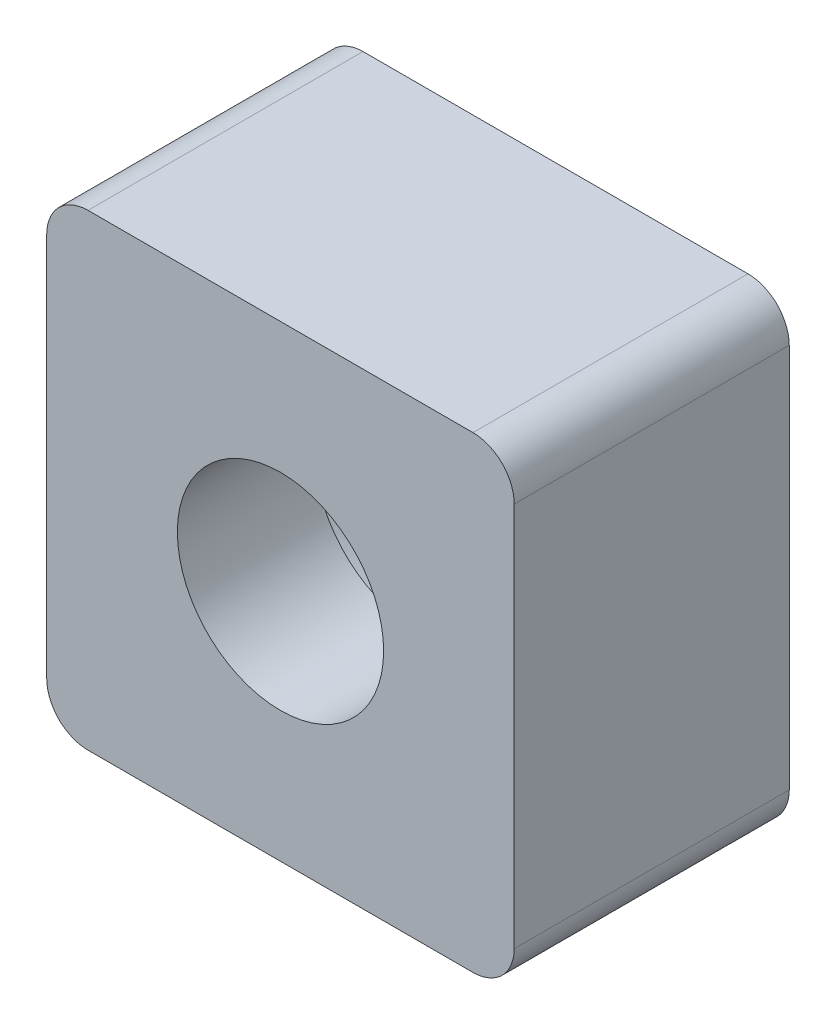
ISO-10303-21;
HEADER;
FILE_DESCRIPTION(('STEP AP214'),'2;1');
FILE_NAME('part.step','',(''),(''),'','','');
FILE_SCHEMA(('AUTOMOTIVE_DESIGN { 1 0 10303 214 1 1 1 1 }'));
ENDSEC;
DATA;
#1=APPLICATION_CONTEXT('core data for automotive mechanical design processes');
#2=APPLICATION_PROTOCOL_DEFINITION('international standard','automotive_design',2000,#1);
#3=PRODUCT_CONTEXT('',#1,'mechanical');
#4=PRODUCT('Part','Part','',(#3));
#5=PRODUCT_RELATED_PRODUCT_CATEGORY('part','',(#4));
#6=PRODUCT_DEFINITION_FORMATION('','',#4);
#7=PRODUCT_DEFINITION_CONTEXT('part definition',#1,'design');
#8=PRODUCT_DEFINITION('design','',#6,#7);
#9=PRODUCT_DEFINITION_SHAPE('','',#8);
#10=(LENGTH_UNIT() NAMED_UNIT(*) SI_UNIT(.MILLI.,.METRE.));
#11=(NAMED_UNIT(*) PLANE_ANGLE_UNIT() SI_UNIT($,.RADIAN.));
#12=(NAMED_UNIT(*) SI_UNIT($,.STERADIAN.) SOLID_ANGLE_UNIT());
#13=UNCERTAINTY_MEASURE_WITH_UNIT(LENGTH_MEASURE(1.E-05),#10,'distance_accuracy_value','');
#14=(GEOMETRIC_REPRESENTATION_CONTEXT(3) GLOBAL_UNCERTAINTY_ASSIGNED_CONTEXT((#13)) GLOBAL_UNIT_ASSIGNED_CONTEXT((#10,
#11,#12)) REPRESENTATION_CONTEXT('',''));
#15=CARTESIAN_POINT('',(0.,0.,0.));
#16=DIRECTION('',(0.,0.,1.));
#17=DIRECTION('',(1.,0.,0.));
#18=AXIS2_PLACEMENT_3D('',#15,#16,#17);
#19=CARTESIAN_POINT('',(0.,0.,-4.24264068711929));
#20=DIRECTION('',(0.,0.,1.));
#21=DIRECTION('',(1.,0.,0.));
#22=AXIS2_PLACEMENT_3D('',#19,#20,#21);
#23=CYLINDRICAL_SURFACE('',#22,1.5);
#24=CARTESIAN_POINT('',(0.,0.,4.));
#25=DIRECTION('',(0.,0.,1.));
#26=DIRECTION('',(1.,0.,0.));
#27=AXIS2_PLACEMENT_3D('',#24,#25,#26);
#28=CIRCLE('',#27,1.5);
#29=CARTESIAN_POINT('',(1.5,0.,4.));
#30=VERTEX_POINT('',#29);
#31=EDGE_CURVE('E210',#30,#30,#28,.T.);
#32=ORIENTED_EDGE('',*,*,#31,.T.);
#33=EDGE_LOOP('',(#32));
#34=FACE_BOUND('',#33,.T.);
#35=CARTESIAN_POINT('',(0.,0.,2.));
#36=DIRECTION('',(0.,0.,-1.));
#37=DIRECTION('',(-1.,0.,0.));
#38=AXIS2_PLACEMENT_3D('',#35,#36,#37);
#39=CIRCLE('',#38,1.5);
#40=CARTESIAN_POINT('',(-1.5,0.,2.));
#41=VERTEX_POINT('',#40);
#42=EDGE_CURVE('E39',#41,#41,#39,.F.);
#43=ORIENTED_EDGE('',*,*,#42,.F.);
#44=EDGE_LOOP('',(#43));
#45=FACE_BOUND('',#44,.T.);
#46=ADVANCED_FACE('F34',(#34,#45),#23,.F.);
#47=CARTESIAN_POINT('',(-2.79989338457967,3.40000000000003,4.));
#48=CARTESIAN_POINT('',(-2.95296602899174,3.40000000000008,4.));
#49=CARTESIAN_POINT('',(-3.27188283407694,3.27198446625344,4.));
#50=CARTESIAN_POINT('',(-3.39988196149886,2.95307118720388,4.));
#51=CARTESIAN_POINT('',(-3.3998819614989,2.80000000000004,4.));
#52=B_SPLINE_CURVE_WITH_KNOTS('',3,(#47,#48,#49,#50,#51),.UNSPECIFIED.,.F.,.F.,(4,1,4),
(-3.14159265358977,-2.35619449019233,-1.57079632679489),.UNSPECIFIED.);
#53=DIRECTION('',(0.,0.,-1.));
#54=VECTOR('',#53,1.);
#55=SURFACE_OF_LINEAR_EXTRUSION('',#52,#54);
#56=CARTESIAN_POINT('',(-2.79989338457967,3.40000000000003,0.));
#57=CARTESIAN_POINT('',(-2.95296602899174,3.40000000000008,0.));
#58=CARTESIAN_POINT('',(-3.27188283407694,3.27198446625344,0.));
#59=CARTESIAN_POINT('',(-3.39988196149886,2.95307118720388,0.));
#60=CARTESIAN_POINT('',(-3.3998819614989,2.80000000000004,0.));
#61=B_SPLINE_CURVE_WITH_KNOTS('',3,(#56,#57,#58,#59,#60),.UNSPECIFIED.,.F.,.F.,(4,1,4),
(-3.14159265358977,-2.35619449019233,-1.57079632679489),.UNSPECIFIED.);
#62=CARTESIAN_POINT('',(-2.79989338457967,3.4,0.));
#63=VERTEX_POINT('',#62);
#64=CARTESIAN_POINT('',(-3.3998819614989,2.80000000000004,0.));
#65=VERTEX_POINT('',#64);
#66=EDGE_CURVE('E206',#63,#65,#61,.T.);
#67=ORIENTED_EDGE('',*,*,#66,.T.);
#68=DIRECTION('',(0.,0.,-1.));
#69=VECTOR('',#68,1.);
#70=CARTESIAN_POINT('',(-3.3998819614989,2.80000000000004,4.));
#71=LINE('',#70,#69);
#72=CARTESIAN_POINT('',(-3.3998819614989,2.80000000000004,4.));
#73=VERTEX_POINT('',#72);
#74=EDGE_CURVE('E11',#73,#65,#71,.T.);
#75=ORIENTED_EDGE('',*,*,#74,.F.);
#76=CARTESIAN_POINT('',(-2.79989338457967,3.4,4.));
#77=VERTEX_POINT('',#76);
#78=EDGE_CURVE('E243',#77,#73,#52,.T.);
#79=ORIENTED_EDGE('',*,*,#78,.F.);
#80=DIRECTION('',(0.,0.,-1.));
#81=VECTOR('',#80,1.);
#82=CARTESIAN_POINT('',(-2.79989338457967,3.4,4.));
#83=LINE('',#82,#81);
#84=EDGE_CURVE('E129',#77,#63,#83,.T.);
#85=ORIENTED_EDGE('',*,*,#84,.T.);
#86=EDGE_LOOP('',(#67,#75,#79,#85));
#87=FACE_BOUND('',#86,.T.);
#88=ADVANCED_FACE('F36',(#87),#55,.F.);
#89=CARTESIAN_POINT('',(-3.3998819614989,2.80000000000004,4.));
#90=DIRECTION('',(1.,0.,0.));
#91=DIRECTION('',(0.,1.,0.));
#92=AXIS2_PLACEMENT_3D('',#89,#90,#91);
#93=PLANE('',#92);
#94=DIRECTION('',(0.,-1.,0.));
#95=VECTOR('',#94,1.);
#96=CARTESIAN_POINT('',(-3.3998819614989,2.80000000000004,0.));
#97=LINE('',#96,#95);
#98=CARTESIAN_POINT('',(-3.39988196149889,-2.80000000000004,0.));
#99=VERTEX_POINT('',#98);
#100=EDGE_CURVE('E208',#65,#99,#97,.T.);
#101=ORIENTED_EDGE('',*,*,#100,.T.);
#102=DIRECTION('',(0.,0.,-1.));
#103=VECTOR('',#102,1.);
#104=CARTESIAN_POINT('',(-3.39988196149889,-2.80000000000004,4.));
#105=LINE('',#104,#103);
#106=CARTESIAN_POINT('',(-3.39988196149889,-2.80000000000004,4.));
#107=VERTEX_POINT('',#106);
#108=EDGE_CURVE('E45',#107,#99,#105,.T.);
#109=ORIENTED_EDGE('',*,*,#108,.F.);
#110=DIRECTION('',(0.,-1.,0.));
#111=VECTOR('',#110,1.);
#112=CARTESIAN_POINT('',(-3.3998819614989,2.80000000000004,4.));
#113=LINE('',#112,#111);
#114=EDGE_CURVE('E96',#73,#107,#113,.T.);
#115=ORIENTED_EDGE('',*,*,#114,.F.);
#116=ORIENTED_EDGE('',*,*,#74,.T.);
#117=EDGE_LOOP('',(#101,#109,#115,#116));
#118=FACE_BOUND('',#117,.T.);
#119=ADVANCED_FACE('F172',(#118),#93,.F.);
#120=CARTESIAN_POINT('',(-3.3998819614989,-2.80000000000004,4.));
#121=CARTESIAN_POINT('',(-3.39988196149896,-2.95307118720388,4.));
#122=CARTESIAN_POINT('',(-3.27188283407687,-3.27198446625344,4.));
#123=CARTESIAN_POINT('',(-2.95296602899173,-3.40000000000003,4.));
#124=CARTESIAN_POINT('',(-2.79989338457965,-3.40000000000008,4.));
#125=B_SPLINE_CURVE_WITH_KNOTS('',3,(#120,#121,#122,#123,#124),.UNSPECIFIED.,.F.,.F.,(4,1,4),
(-1.57079632679526,-0.785398163397782,-3.00696852117388E-13),.UNSPECIFIED.);
#126=DIRECTION('',(0.,0.,-1.));
#127=VECTOR('',#126,1.);
#128=SURFACE_OF_LINEAR_EXTRUSION('',#125,#127);
#129=CARTESIAN_POINT('',(-3.3998819614989,-2.80000000000004,0.));
#130=CARTESIAN_POINT('',(-3.39988196149896,-2.95307118720388,0.));
#131=CARTESIAN_POINT('',(-3.27188283407687,-3.27198446625344,0.));
#132=CARTESIAN_POINT('',(-2.95296602899173,-3.40000000000003,0.));
#133=CARTESIAN_POINT('',(-2.79989338457965,-3.40000000000008,0.));
#134=B_SPLINE_CURVE_WITH_KNOTS('',3,(#129,#130,#131,#132,#133),.UNSPECIFIED.,.F.,.F.,(4,1,4),
(-1.57079632679526,-0.785398163397782,-3.00696852117388E-13),.UNSPECIFIED.);
#135=CARTESIAN_POINT('',(-2.79989338457965,-3.40000000000008,0.));
#136=VERTEX_POINT('',#135);
#137=EDGE_CURVE('E211',#99,#136,#134,.T.);
#138=ORIENTED_EDGE('',*,*,#137,.T.);
#139=DIRECTION('',(0.,0.,-1.));
#140=VECTOR('',#139,1.);
#141=CARTESIAN_POINT('',(-2.79989338457965,-3.40000000000008,4.));
#142=LINE('',#141,#140);
#143=CARTESIAN_POINT('',(-2.79989338457965,-3.40000000000008,4.));
#144=VERTEX_POINT('',#143);
#145=EDGE_CURVE('E250',#144,#136,#142,.T.);
#146=ORIENTED_EDGE('',*,*,#145,.F.);
#147=EDGE_CURVE('E162',#107,#144,#125,.T.);
#148=ORIENTED_EDGE('',*,*,#147,.F.);
#149=ORIENTED_EDGE('',*,*,#108,.T.);
#150=EDGE_LOOP('',(#138,#146,#148,#149));
#151=FACE_BOUND('',#150,.T.);
#152=ADVANCED_FACE('F170',(#151),#128,.F.);
#153=CARTESIAN_POINT('',(-2.79989338457967,-3.40000000000003,4.));
#154=DIRECTION('',(0.,1.,0.));
#155=DIRECTION('',(-1.,0.,0.));
#156=AXIS2_PLACEMENT_3D('',#153,#154,#155);
#157=PLANE('',#156);
#158=DIRECTION('',(1.,0.,0.));
#159=VECTOR('',#158,1.);
#160=CARTESIAN_POINT('',(-2.79989338457967,-3.40000000000003,0.));
#161=LINE('',#160,#159);
#162=CARTESIAN_POINT('',(2.79989338457971,-3.40000000000008,0.));
#163=VERTEX_POINT('',#162);
#164=EDGE_CURVE('E223',#136,#163,#161,.T.);
#165=ORIENTED_EDGE('',*,*,#164,.T.);
#166=DIRECTION('',(0.,0.,-1.));
#167=VECTOR('',#166,1.);
#168=CARTESIAN_POINT('',(2.79989338457971,-3.40000000000008,4.));
#169=LINE('',#168,#167);
#170=CARTESIAN_POINT('',(2.79989338457971,-3.40000000000008,4.));
#171=VERTEX_POINT('',#170);
#172=EDGE_CURVE('E247',#171,#163,#169,.T.);
#173=ORIENTED_EDGE('',*,*,#172,.F.);
#174=DIRECTION('',(1.,0.,0.));
#175=VECTOR('',#174,1.);
#176=CARTESIAN_POINT('',(-2.79989338457967,-3.40000000000003,4.));
#177=LINE('',#176,#175);
#178=EDGE_CURVE('E157',#144,#171,#177,.T.);
#179=ORIENTED_EDGE('',*,*,#178,.F.);
#180=ORIENTED_EDGE('',*,*,#145,.T.);
#181=EDGE_LOOP('',(#165,#173,#179,#180));
#182=FACE_BOUND('',#181,.T.);
#183=ADVANCED_FACE('F150',(#182),#157,.F.);
#184=CARTESIAN_POINT('',(2.79989338457971,-3.40000000000008,4.));
#185=CARTESIAN_POINT('',(2.95296602899178,-3.40000000000007,4.));
#186=CARTESIAN_POINT('',(3.27188283407693,-3.27198446625344,4.));
#187=CARTESIAN_POINT('',(3.39988196149893,-2.95307118720388,4.));
#188=CARTESIAN_POINT('',(3.39988196149891,-2.80000000000004,4.));
#189=B_SPLINE_CURVE_WITH_KNOTS('',3,(#184,#185,#186,#187,#188),.UNSPECIFIED.,.F.,.F.,(4,1,4),
(0.,0.785398163397447,1.57079632679489),.UNSPECIFIED.);
#190=DIRECTION('',(0.,0.,-1.));
#191=VECTOR('',#190,1.);
#192=SURFACE_OF_LINEAR_EXTRUSION('',#189,#191);
#193=CARTESIAN_POINT('',(2.79989338457971,-3.40000000000008,0.));
#194=CARTESIAN_POINT('',(2.95296602899178,-3.40000000000007,0.));
#195=CARTESIAN_POINT('',(3.27188283407693,-3.27198446625344,0.));
#196=CARTESIAN_POINT('',(3.39988196149893,-2.95307118720388,0.));
#197=CARTESIAN_POINT('',(3.39988196149891,-2.80000000000004,0.));
#198=B_SPLINE_CURVE_WITH_KNOTS('',3,(#193,#194,#195,#196,#197),.UNSPECIFIED.,.F.,.F.,(4,1,4),
(0.,0.785398163397447,1.57079632679489),.UNSPECIFIED.);
#199=CARTESIAN_POINT('',(3.39988196149891,-2.80000000000004,0.));
#200=VERTEX_POINT('',#199);
#201=EDGE_CURVE('E228',#163,#200,#198,.T.);
#202=ORIENTED_EDGE('',*,*,#201,.T.);
#203=DIRECTION('',(0.,0.,-1.));
#204=VECTOR('',#203,1.);
#205=CARTESIAN_POINT('',(3.39988196149891,-2.80000000000004,4.));
#206=LINE('',#205,#204);
#207=CARTESIAN_POINT('',(3.39988196149891,-2.80000000000004,4.));
#208=VERTEX_POINT('',#207);
#209=EDGE_CURVE('E124',#208,#200,#206,.T.);
#210=ORIENTED_EDGE('',*,*,#209,.F.);
#211=EDGE_CURVE('E115',#171,#208,#189,.T.);
#212=ORIENTED_EDGE('',*,*,#211,.F.);
#213=ORIENTED_EDGE('',*,*,#172,.T.);
#214=EDGE_LOOP('',(#202,#210,#212,#213));
#215=FACE_BOUND('',#214,.T.);
#216=ADVANCED_FACE('F147',(#215),#192,.F.);
#217=CARTESIAN_POINT('',(3.39988196149895,-2.80000000000001,4.));
#218=DIRECTION('',(-1.,0.,0.));
#219=DIRECTION('',(0.,-1.,0.));
#220=AXIS2_PLACEMENT_3D('',#217,#218,#219);
#221=PLANE('',#220);
#222=DIRECTION('',(0.,1.,0.));
#223=VECTOR('',#222,1.);
#224=CARTESIAN_POINT('',(3.39988196149895,-2.80000000000001,0.));
#225=LINE('',#224,#223);
#226=CARTESIAN_POINT('',(3.39988196149893,2.79999999999997,0.));
#227=VERTEX_POINT('',#226);
#228=EDGE_CURVE('E123',#200,#227,#225,.T.);
#229=ORIENTED_EDGE('',*,*,#228,.T.);
#230=DIRECTION('',(0.,0.,-1.));
#231=VECTOR('',#230,1.);
#232=CARTESIAN_POINT('',(3.39988196149893,2.79999999999997,4.));
#233=LINE('',#232,#231);
#234=CARTESIAN_POINT('',(3.39988196149893,2.79999999999997,4.));
#235=VERTEX_POINT('',#234);
#236=EDGE_CURVE('E120',#235,#227,#233,.T.);
#237=ORIENTED_EDGE('',*,*,#236,.F.);
#238=DIRECTION('',(0.,1.,0.));
#239=VECTOR('',#238,1.);
#240=CARTESIAN_POINT('',(3.39988196149895,-2.80000000000001,4.));
#241=LINE('',#240,#239);
#242=EDGE_CURVE('E109',#208,#235,#241,.T.);
#243=ORIENTED_EDGE('',*,*,#242,.F.);
#244=ORIENTED_EDGE('',*,*,#209,.T.);
#245=EDGE_LOOP('',(#229,#237,#243,#244));
#246=FACE_BOUND('',#245,.T.);
#247=ADVANCED_FACE('F121',(#246),#221,.F.);
#248=CARTESIAN_POINT('',(3.39988196149893,2.79999999999997,4.));
#249=CARTESIAN_POINT('',(3.39988196149892,2.95307118720381,4.));
#250=CARTESIAN_POINT('',(3.27188283407692,3.27198446625343,4.));
#251=CARTESIAN_POINT('',(2.95296602899178,3.40000000000001,4.));
#252=CARTESIAN_POINT('',(2.79989338457971,3.40000000000003,4.));
#253=B_SPLINE_CURVE_WITH_KNOTS('',3,(#248,#249,#250,#251,#252),.UNSPECIFIED.,.F.,.F.,(4,1,4),
(1.57079632679488,2.35619449019234,3.14159265358979),.UNSPECIFIED.);
#254=DIRECTION('',(0.,0.,-1.));
#255=VECTOR('',#254,1.);
#256=SURFACE_OF_LINEAR_EXTRUSION('',#253,#255);
#257=CARTESIAN_POINT('',(3.39988196149893,2.79999999999997,0.));
#258=CARTESIAN_POINT('',(3.39988196149892,2.95307118720381,0.));
#259=CARTESIAN_POINT('',(3.27188283407692,3.27198446625343,0.));
#260=CARTESIAN_POINT('',(2.95296602899178,3.40000000000001,0.));
#261=CARTESIAN_POINT('',(2.79989338457971,3.40000000000003,0.));
#262=B_SPLINE_CURVE_WITH_KNOTS('',3,(#257,#258,#259,#260,#261),.UNSPECIFIED.,.F.,.F.,(4,1,4),
(1.57079632679488,2.35619449019234,3.14159265358979),.UNSPECIFIED.);
#263=CARTESIAN_POINT('',(2.79989338457971,3.40000000000003,0.));
#264=VERTEX_POINT('',#263);
#265=EDGE_CURVE('E82',#227,#264,#262,.T.);
#266=ORIENTED_EDGE('',*,*,#265,.T.);
#267=DIRECTION('',(0.,0.,-1.));
#268=VECTOR('',#267,1.);
#269=CARTESIAN_POINT('',(2.79989338457971,3.40000000000003,4.));
#270=LINE('',#269,#268);
#271=CARTESIAN_POINT('',(2.79989338457971,3.40000000000003,4.));
#272=VERTEX_POINT('',#271);
#273=EDGE_CURVE('E125',#272,#264,#270,.T.);
#274=ORIENTED_EDGE('',*,*,#273,.F.);
#275=EDGE_CURVE('E113',#235,#272,#253,.T.);
#276=ORIENTED_EDGE('',*,*,#275,.F.);
#277=ORIENTED_EDGE('',*,*,#236,.T.);
#278=EDGE_LOOP('',(#266,#274,#276,#277));
#279=FACE_BOUND('',#278,.T.);
#280=ADVANCED_FACE('F127',(#279),#256,.F.);
#281=CARTESIAN_POINT('',(2.79989338457971,3.39999999999999,4.));
#282=DIRECTION('',(0.,-1.,0.));
#283=DIRECTION('',(1.,0.,0.));
#284=AXIS2_PLACEMENT_3D('',#281,#282,#283);
#285=PLANE('',#284);
#286=DIRECTION('',(-1.,0.,0.));
#287=VECTOR('',#286,1.);
#288=CARTESIAN_POINT('',(2.79989338457971,3.39999999999999,0.));
#289=LINE('',#288,#287);
#290=EDGE_CURVE('E88',#264,#63,#289,.T.);
#291=ORIENTED_EDGE('',*,*,#290,.T.);
#292=ORIENTED_EDGE('',*,*,#84,.F.);
#293=DIRECTION('',(-1.,0.,0.));
#294=VECTOR('',#293,1.);
#295=CARTESIAN_POINT('',(2.79989338457971,3.39999999999999,4.));
#296=LINE('',#295,#294);
#297=EDGE_CURVE('E53',#272,#77,#296,.T.);
#298=ORIENTED_EDGE('',*,*,#297,.F.);
#299=ORIENTED_EDGE('',*,*,#273,.T.);
#300=EDGE_LOOP('',(#291,#292,#298,#299));
#301=FACE_BOUND('',#300,.T.);
#302=ADVANCED_FACE('F143',(#301),#285,.F.);
#303=CARTESIAN_POINT('',(-3.22415341466112,3.22426002992771,4.));
#304=DIRECTION('',(0.,0.,-1.));
#305=DIRECTION('',(-1.,0.,0.));
#306=AXIS2_PLACEMENT_3D('',#303,#304,#305);
#307=PLANE('',#306);
#308=ORIENTED_EDGE('',*,*,#31,.F.);
#309=EDGE_LOOP('',(#308));
#310=FACE_BOUND('',#309,.T.);
#311=ORIENTED_EDGE('',*,*,#78,.T.);
#312=ORIENTED_EDGE('',*,*,#114,.T.);
#313=ORIENTED_EDGE('',*,*,#147,.T.);
#314=ORIENTED_EDGE('',*,*,#178,.T.);
#315=ORIENTED_EDGE('',*,*,#211,.T.);
#316=ORIENTED_EDGE('',*,*,#242,.T.);
#317=ORIENTED_EDGE('',*,*,#275,.T.);
#318=ORIENTED_EDGE('',*,*,#297,.T.);
#319=EDGE_LOOP('',(#311,#312,#313,#314,#315,#316,#317,#318));
#320=FACE_BOUND('',#319,.T.);
#321=ADVANCED_FACE('F111',(#310,#320),#307,.F.);
#322=CARTESIAN_POINT('',(-3.22415341466112,3.22426002992771,0.));
#323=DIRECTION('',(0.,0.,-1.));
#324=DIRECTION('',(-1.,0.,0.));
#325=AXIS2_PLACEMENT_3D('',#322,#323,#324);
#326=PLANE('',#325);
#327=CARTESIAN_POINT('',(0.,0.,0.));
#328=DIRECTION('',(0.,0.,-1.));
#329=DIRECTION('',(-1.,0.,0.));
#330=AXIS2_PLACEMENT_3D('',#327,#328,#329);
#331=CIRCLE('',#330,3.);
#332=CARTESIAN_POINT('',(-3.,0.,0.));
#333=VERTEX_POINT('',#332);
#334=EDGE_CURVE('E203',#333,#333,#331,.T.);
#335=ORIENTED_EDGE('',*,*,#334,.F.);
#336=EDGE_LOOP('',(#335));
#337=FACE_BOUND('',#336,.T.);
#338=ORIENTED_EDGE('',*,*,#66,.F.);
#339=ORIENTED_EDGE('',*,*,#290,.F.);
#340=ORIENTED_EDGE('',*,*,#265,.F.);
#341=ORIENTED_EDGE('',*,*,#228,.F.);
#342=ORIENTED_EDGE('',*,*,#201,.F.);
#343=ORIENTED_EDGE('',*,*,#164,.F.);
#344=ORIENTED_EDGE('',*,*,#137,.F.);
#345=ORIENTED_EDGE('',*,*,#100,.F.);
#346=EDGE_LOOP('',(#338,#339,#340,#341,#342,#343,#344,#345));
#347=FACE_BOUND('',#346,.T.);
#348=ADVANCED_FACE('F191',(#337,#347),#326,.T.);
#349=CARTESIAN_POINT('',(0.,0.,2.));
#350=DIRECTION('',(0.,0.,-1.));
#351=DIRECTION('',(-1.,0.,0.));
#352=AXIS2_PLACEMENT_3D('',#349,#350,#351);
#353=PLANE('',#352);
#354=CARTESIAN_POINT('',(0.,0.,2.));
#355=DIRECTION('',(0.,0.,-1.));
#356=DIRECTION('',(-1.,0.,0.));
#357=AXIS2_PLACEMENT_3D('',#354,#355,#356);
#358=CIRCLE('',#357,3.);
#359=CARTESIAN_POINT('',(-3.,0.,2.));
#360=VERTEX_POINT('',#359);
#361=EDGE_CURVE('E270',#360,#360,#358,.T.);
#362=ORIENTED_EDGE('',*,*,#361,.T.);
#363=EDGE_LOOP('',(#362));
#364=FACE_BOUND('',#363,.T.);
#365=ORIENTED_EDGE('',*,*,#42,.T.);
#366=EDGE_LOOP('',(#365));
#367=FACE_BOUND('',#366,.T.);
#368=ADVANCED_FACE('F194',(#364,#367),#353,.T.);
#369=CARTESIAN_POINT('',(0.,0.,2.));
#370=DIRECTION('',(0.,0.,-1.));
#371=DIRECTION('',(-1.,0.,0.));
#372=AXIS2_PLACEMENT_3D('',#369,#370,#371);
#373=CYLINDRICAL_SURFACE('',#372,3.);
#374=ORIENTED_EDGE('',*,*,#361,.F.);
#375=EDGE_LOOP('',(#374));
#376=FACE_BOUND('',#375,.T.);
#377=ORIENTED_EDGE('',*,*,#334,.T.);
#378=EDGE_LOOP('',(#377));
#379=FACE_BOUND('',#378,.T.);
#380=ADVANCED_FACE('F188',(#376,#379),#373,.F.);
#381=CLOSED_SHELL('',(#46,#88,#119,#152,#183,#216,#247,#280,#302,#321,#348,#368,#380));
#382=MANIFOLD_SOLID_BREP('B2',#381);
#383=ADVANCED_BREP_SHAPE_REPRESENTATION('',(#18,#382),#14);
#384=SHAPE_DEFINITION_REPRESENTATION(#9,#383);
ENDSEC;
END-ISO-10303-21;
